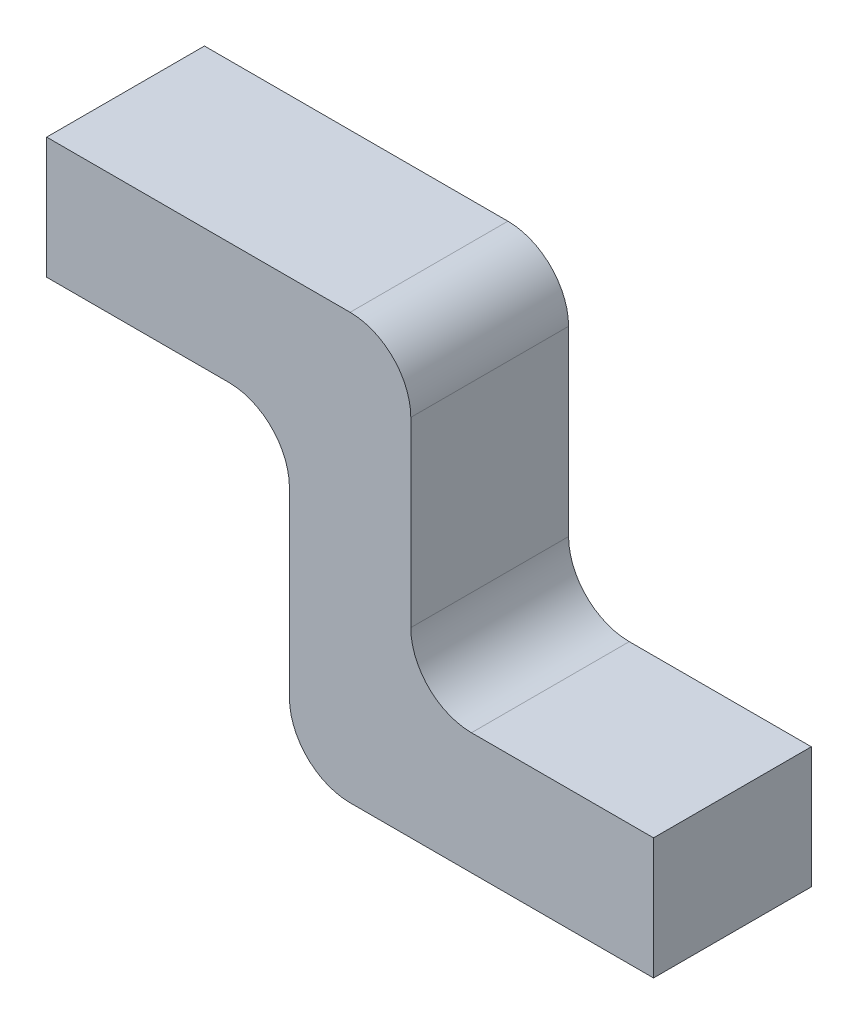
ISO-10303-21;
HEADER;
FILE_DESCRIPTION(('STEP AP214'),'2;1');
FILE_NAME('part.step','',(''),(''),'','','');
FILE_SCHEMA(('AUTOMOTIVE_DESIGN { 1 0 10303 214 1 1 1 1 }'));
ENDSEC;
DATA;
#1=APPLICATION_CONTEXT('core data for automotive mechanical design processes');
#2=APPLICATION_PROTOCOL_DEFINITION('international standard','automotive_design',2000,#1);
#3=PRODUCT_CONTEXT('',#1,'mechanical');
#4=PRODUCT('Part','Part','',(#3));
#5=PRODUCT_RELATED_PRODUCT_CATEGORY('part','',(#4));
#6=PRODUCT_DEFINITION_FORMATION('','',#4);
#7=PRODUCT_DEFINITION_CONTEXT('part definition',#1,'design');
#8=PRODUCT_DEFINITION('design','',#6,#7);
#9=PRODUCT_DEFINITION_SHAPE('','',#8);
#10=(LENGTH_UNIT() NAMED_UNIT(*) SI_UNIT(.MILLI.,.METRE.));
#11=(NAMED_UNIT(*) PLANE_ANGLE_UNIT() SI_UNIT($,.RADIAN.));
#12=(NAMED_UNIT(*) SI_UNIT($,.STERADIAN.) SOLID_ANGLE_UNIT());
#13=UNCERTAINTY_MEASURE_WITH_UNIT(LENGTH_MEASURE(1.E-05),#10,'distance_accuracy_value','');
#14=(GEOMETRIC_REPRESENTATION_CONTEXT(3) GLOBAL_UNCERTAINTY_ASSIGNED_CONTEXT((#13)) GLOBAL_UNIT_ASSIGNED_CONTEXT((#10,
#11,#12)) REPRESENTATION_CONTEXT('',''));
#15=CARTESIAN_POINT('',(0.,0.,0.));
#16=DIRECTION('',(0.,0.,1.));
#17=DIRECTION('',(1.,0.,0.));
#18=AXIS2_PLACEMENT_3D('',#15,#16,#17);
#19=CARTESIAN_POINT('',(0.3,0.4,0.13));
#20=DIRECTION('',(0.,0.,1.));
#21=DIRECTION('',(1.,0.,0.));
#22=AXIS2_PLACEMENT_3D('',#19,#20,#21);
#23=PLANE('',#22);
#24=DIRECTION('',(0.,1.,0.));
#25=VECTOR('',#24,1.);
#26=CARTESIAN_POINT('',(0.6,0.3,0.13));
#27=LINE('',#26,#25);
#28=CARTESIAN_POINT('',(0.6,0.6,0.13));
#29=VERTEX_POINT('',#28);
#30=CARTESIAN_POINT('',(0.6,0.3,0.13));
#31=VERTEX_POINT('',#30);
#32=EDGE_CURVE('E185',#29,#31,#27,.F.);
#33=ORIENTED_EDGE('',*,*,#32,.F.);
#34=CARTESIAN_POINT('',(0.5,0.6,0.13));
#35=DIRECTION('',(0.,0.,1.));
#36=DIRECTION('',(1.,0.,0.));
#37=AXIS2_PLACEMENT_3D('',#34,#35,#36);
#38=CIRCLE('',#37,0.1);
#39=CARTESIAN_POINT('',(0.5,0.7,0.13));
#40=VERTEX_POINT('',#39);
#41=EDGE_CURVE('E187',#40,#29,#38,.F.);
#42=ORIENTED_EDGE('',*,*,#41,.F.);
#43=DIRECTION('',(-1.,0.,0.));
#44=VECTOR('',#43,1.);
#45=CARTESIAN_POINT('',(0.5,0.7,0.13));
#46=LINE('',#45,#44);
#47=CARTESIAN_POINT('',(0.,0.7,0.13));
#48=VERTEX_POINT('',#47);
#49=EDGE_CURVE('E126',#48,#40,#46,.F.);
#50=ORIENTED_EDGE('',*,*,#49,.F.);
#51=DIRECTION('',(0.,-1.,0.));
#52=VECTOR('',#51,1.);
#53=CARTESIAN_POINT('',(0.,0.7,0.13));
#54=LINE('',#53,#52);
#55=CARTESIAN_POINT('',(0.,0.5,0.13));
#56=VERTEX_POINT('',#55);
#57=EDGE_CURVE('E124',#56,#48,#54,.F.);
#58=ORIENTED_EDGE('',*,*,#57,.F.);
#59=DIRECTION('',(1.,0.,0.));
#60=VECTOR('',#59,1.);
#61=CARTESIAN_POINT('',(0.,0.5,0.13));
#62=LINE('',#61,#60);
#63=CARTESIAN_POINT('',(0.3,0.5,0.13));
#64=VERTEX_POINT('',#63);
#65=EDGE_CURVE('E88',#64,#56,#62,.F.);
#66=ORIENTED_EDGE('',*,*,#65,.F.);
#67=CARTESIAN_POINT('',(0.3,0.4,0.13));
#68=DIRECTION('',(0.,0.,1.));
#69=DIRECTION('',(1.,0.,0.));
#70=AXIS2_PLACEMENT_3D('',#67,#68,#69);
#71=CIRCLE('',#70,0.1);
#72=CARTESIAN_POINT('',(0.4,0.4,0.13));
#73=VERTEX_POINT('',#72);
#74=EDGE_CURVE('E20',#64,#73,#71,.F.);
#75=ORIENTED_EDGE('',*,*,#74,.T.);
#76=DIRECTION('',(0.,1.,0.));
#77=VECTOR('',#76,1.);
#78=CARTESIAN_POINT('',(0.4,0.4,0.13));
#79=LINE('',#78,#77);
#80=CARTESIAN_POINT('',(0.4,0.1,0.13));
#81=VERTEX_POINT('',#80);
#82=EDGE_CURVE('E230',#81,#73,#79,.T.);
#83=ORIENTED_EDGE('',*,*,#82,.F.);
#84=CARTESIAN_POINT('',(0.5,0.1,0.13));
#85=DIRECTION('',(0.,0.,1.));
#86=DIRECTION('',(1.,0.,0.));
#87=AXIS2_PLACEMENT_3D('',#84,#85,#86);
#88=CIRCLE('',#87,0.1);
#89=CARTESIAN_POINT('',(0.5,0.,0.13));
#90=VERTEX_POINT('',#89);
#91=EDGE_CURVE('E227',#90,#81,#88,.F.);
#92=ORIENTED_EDGE('',*,*,#91,.F.);
#93=DIRECTION('',(1.,0.,0.));
#94=VECTOR('',#93,1.);
#95=CARTESIAN_POINT('',(0.5,0.,0.13));
#96=LINE('',#95,#94);
#97=CARTESIAN_POINT('',(1.,0.,0.13));
#98=VERTEX_POINT('',#97);
#99=EDGE_CURVE('E224',#98,#90,#96,.F.);
#100=ORIENTED_EDGE('',*,*,#99,.F.);
#101=DIRECTION('',(0.,1.,0.));
#102=VECTOR('',#101,1.);
#103=CARTESIAN_POINT('',(1.,0.,0.13));
#104=LINE('',#103,#102);
#105=CARTESIAN_POINT('',(1.,0.2,0.13));
#106=VERTEX_POINT('',#105);
#107=EDGE_CURVE('E219',#106,#98,#104,.F.);
#108=ORIENTED_EDGE('',*,*,#107,.F.);
#109=DIRECTION('',(-1.,0.,0.));
#110=VECTOR('',#109,1.);
#111=CARTESIAN_POINT('',(1.,0.2,0.13));
#112=LINE('',#111,#110);
#113=CARTESIAN_POINT('',(0.7,0.2,0.13));
#114=VERTEX_POINT('',#113);
#115=EDGE_CURVE('E207',#114,#106,#112,.F.);
#116=ORIENTED_EDGE('',*,*,#115,.F.);
#117=CARTESIAN_POINT('',(0.7,0.3,0.13));
#118=DIRECTION('',(0.,0.,1.));
#119=DIRECTION('',(1.,0.,0.));
#120=AXIS2_PLACEMENT_3D('',#117,#118,#119);
#121=CIRCLE('',#120,0.1);
#122=EDGE_CURVE('E189',#114,#31,#121,.F.);
#123=ORIENTED_EDGE('',*,*,#122,.T.);
#124=EDGE_LOOP('',(#33,#42,#50,#58,#66,#75,#83,#92,#100,#108,#116,#123));
#125=FACE_BOUND('',#124,.T.);
#126=ADVANCED_FACE('F17',(#125),#23,.T.);
#127=CARTESIAN_POINT('',(0.,0.7,-0.13));
#128=DIRECTION('',(-1.,0.,0.));
#129=DIRECTION('',(0.,-1.,0.));
#130=AXIS2_PLACEMENT_3D('',#127,#128,#129);
#131=PLANE('',#130);
#132=DIRECTION('',(0.,0.,1.));
#133=VECTOR('',#132,1.);
#134=CARTESIAN_POINT('',(0.,0.7,-0.13));
#135=LINE('',#134,#133);
#136=CARTESIAN_POINT('',(0.,0.7,-0.13));
#137=VERTEX_POINT('',#136);
#138=EDGE_CURVE('E122',#137,#48,#135,.T.);
#139=ORIENTED_EDGE('',*,*,#138,.F.);
#140=DIRECTION('',(0.,1.,0.));
#141=VECTOR('',#140,1.);
#142=CARTESIAN_POINT('',(0.,0.4,-0.13));
#143=LINE('',#142,#141);
#144=CARTESIAN_POINT('',(0.,0.5,-0.13));
#145=VERTEX_POINT('',#144);
#146=EDGE_CURVE('E110',#137,#145,#143,.F.);
#147=ORIENTED_EDGE('',*,*,#146,.T.);
#148=DIRECTION('',(0.,0.,1.));
#149=VECTOR('',#148,1.);
#150=CARTESIAN_POINT('',(0.,0.5,-0.13));
#151=LINE('',#150,#149);
#152=EDGE_CURVE('E233',#56,#145,#151,.F.);
#153=ORIENTED_EDGE('',*,*,#152,.F.);
#154=ORIENTED_EDGE('',*,*,#57,.T.);
#155=EDGE_LOOP('',(#139,#147,#153,#154));
#156=FACE_BOUND('',#155,.T.);
#157=ADVANCED_FACE('F123',(#156),#131,.T.);
#158=CARTESIAN_POINT('',(0.,0.5,-0.13));
#159=DIRECTION('',(0.,-1.,0.));
#160=DIRECTION('',(1.,0.,0.));
#161=AXIS2_PLACEMENT_3D('',#158,#159,#160);
#162=PLANE('',#161);
#163=ORIENTED_EDGE('',*,*,#152,.T.);
#164=DIRECTION('',(1.,0.,0.));
#165=VECTOR('',#164,1.);
#166=CARTESIAN_POINT('',(0.3,0.5,-0.13));
#167=LINE('',#166,#165);
#168=CARTESIAN_POINT('',(0.3,0.5,-0.13));
#169=VERTEX_POINT('',#168);
#170=EDGE_CURVE('E117',#145,#169,#167,.T.);
#171=ORIENTED_EDGE('',*,*,#170,.T.);
#172=DIRECTION('',(0.,0.,1.));
#173=VECTOR('',#172,1.);
#174=CARTESIAN_POINT('',(0.3,0.5,-0.13));
#175=LINE('',#174,#173);
#176=EDGE_CURVE('E231',#169,#64,#175,.T.);
#177=ORIENTED_EDGE('',*,*,#176,.T.);
#178=ORIENTED_EDGE('',*,*,#65,.T.);
#179=EDGE_LOOP('',(#163,#171,#177,#178));
#180=FACE_BOUND('',#179,.T.);
#181=ADVANCED_FACE('F173',(#180),#162,.T.);
#182=CARTESIAN_POINT('',(0.3,0.4,-0.13));
#183=DIRECTION('',(0.,0.,1.));
#184=DIRECTION('',(1.,0.,0.));
#185=AXIS2_PLACEMENT_3D('',#182,#183,#184);
#186=CYLINDRICAL_SURFACE('',#185,0.1);
#187=ORIENTED_EDGE('',*,*,#74,.F.);
#188=ORIENTED_EDGE('',*,*,#176,.F.);
#189=CARTESIAN_POINT('',(0.3,0.4,-0.13));
#190=DIRECTION('',(0.,0.,1.));
#191=DIRECTION('',(1.,0.,0.));
#192=AXIS2_PLACEMENT_3D('',#189,#190,#191);
#193=CIRCLE('',#192,0.1);
#194=CARTESIAN_POINT('',(0.4,0.4,-0.13));
#195=VERTEX_POINT('',#194);
#196=EDGE_CURVE('E264',#169,#195,#193,.F.);
#197=ORIENTED_EDGE('',*,*,#196,.T.);
#198=DIRECTION('',(0.,0.,1.));
#199=VECTOR('',#198,1.);
#200=CARTESIAN_POINT('',(0.4,0.4,-0.13));
#201=LINE('',#200,#199);
#202=EDGE_CURVE('E228',#73,#195,#201,.F.);
#203=ORIENTED_EDGE('',*,*,#202,.F.);
#204=EDGE_LOOP('',(#187,#188,#197,#203));
#205=FACE_BOUND('',#204,.T.);
#206=ADVANCED_FACE('F169',(#205),#186,.F.);
#207=CARTESIAN_POINT('',(0.4,0.4,-0.13));
#208=DIRECTION('',(-1.,0.,0.));
#209=DIRECTION('',(0.,0.,1.));
#210=AXIS2_PLACEMENT_3D('',#207,#208,#209);
#211=PLANE('',#210);
#212=ORIENTED_EDGE('',*,*,#202,.T.);
#213=DIRECTION('',(0.,1.,0.));
#214=VECTOR('',#213,1.);
#215=CARTESIAN_POINT('',(0.4,0.4,-0.13));
#216=LINE('',#215,#214);
#217=CARTESIAN_POINT('',(0.4,0.1,-0.13));
#218=VERTEX_POINT('',#217);
#219=EDGE_CURVE('E263',#195,#218,#216,.F.);
#220=ORIENTED_EDGE('',*,*,#219,.T.);
#221=DIRECTION('',(0.,0.,1.));
#222=VECTOR('',#221,1.);
#223=CARTESIAN_POINT('',(0.4,0.1,-0.13));
#224=LINE('',#223,#222);
#225=EDGE_CURVE('E225',#81,#218,#224,.F.);
#226=ORIENTED_EDGE('',*,*,#225,.F.);
#227=ORIENTED_EDGE('',*,*,#82,.T.);
#228=EDGE_LOOP('',(#212,#220,#226,#227));
#229=FACE_BOUND('',#228,.T.);
#230=ADVANCED_FACE('F165',(#229),#211,.T.);
#231=CARTESIAN_POINT('',(0.5,0.1,-0.13));
#232=DIRECTION('',(0.,0.,1.));
#233=DIRECTION('',(1.,0.,0.));
#234=AXIS2_PLACEMENT_3D('',#231,#232,#233);
#235=CYLINDRICAL_SURFACE('',#234,0.1);
#236=ORIENTED_EDGE('',*,*,#225,.T.);
#237=CARTESIAN_POINT('',(0.5,0.1,-0.13));
#238=DIRECTION('',(0.,0.,1.));
#239=DIRECTION('',(1.,0.,0.));
#240=AXIS2_PLACEMENT_3D('',#237,#238,#239);
#241=CIRCLE('',#240,0.1);
#242=CARTESIAN_POINT('',(0.5,0.,-0.13));
#243=VERTEX_POINT('',#242);
#244=EDGE_CURVE('E260',#218,#243,#241,.T.);
#245=ORIENTED_EDGE('',*,*,#244,.T.);
#246=DIRECTION('',(0.,0.,-1.));
#247=VECTOR('',#246,1.);
#248=CARTESIAN_POINT('',(0.5,0.,-0.13));
#249=LINE('',#248,#247);
#250=EDGE_CURVE('E222',#90,#243,#249,.T.);
#251=ORIENTED_EDGE('',*,*,#250,.F.);
#252=ORIENTED_EDGE('',*,*,#91,.T.);
#253=EDGE_LOOP('',(#236,#245,#251,#252));
#254=FACE_BOUND('',#253,.T.);
#255=ADVANCED_FACE('F161',(#254),#235,.T.);
#256=CARTESIAN_POINT('',(0.5,0.,-0.13));
#257=DIRECTION('',(0.,-1.,0.));
#258=DIRECTION('',(0.,0.,-1.));
#259=AXIS2_PLACEMENT_3D('',#256,#257,#258);
#260=PLANE('',#259);
#261=ORIENTED_EDGE('',*,*,#250,.T.);
#262=DIRECTION('',(1.,0.,0.));
#263=VECTOR('',#262,1.);
#264=CARTESIAN_POINT('',(0.3,0.,-0.13));
#265=LINE('',#264,#263);
#266=CARTESIAN_POINT('',(1.,0.,-0.13));
#267=VERTEX_POINT('',#266);
#268=EDGE_CURVE('E214',#243,#267,#265,.T.);
#269=ORIENTED_EDGE('',*,*,#268,.T.);
#270=DIRECTION('',(0.,0.,-1.));
#271=VECTOR('',#270,1.);
#272=CARTESIAN_POINT('',(1.,0.,-0.13));
#273=LINE('',#272,#271);
#274=EDGE_CURVE('E217',#98,#267,#273,.T.);
#275=ORIENTED_EDGE('',*,*,#274,.F.);
#276=ORIENTED_EDGE('',*,*,#99,.T.);
#277=EDGE_LOOP('',(#261,#269,#275,#276));
#278=FACE_BOUND('',#277,.T.);
#279=ADVANCED_FACE('F157',(#278),#260,.T.);
#280=CARTESIAN_POINT('',(1.,0.,-0.13));
#281=DIRECTION('',(1.,0.,0.));
#282=DIRECTION('',(0.,0.,-1.));
#283=AXIS2_PLACEMENT_3D('',#280,#281,#282);
#284=PLANE('',#283);
#285=ORIENTED_EDGE('',*,*,#274,.T.);
#286=DIRECTION('',(0.,1.,0.));
#287=VECTOR('',#286,1.);
#288=CARTESIAN_POINT('',(1.,0.4,-0.13));
#289=LINE('',#288,#287);
#290=CARTESIAN_POINT('',(1.,0.2,-0.13));
#291=VERTEX_POINT('',#290);
#292=EDGE_CURVE('E210',#267,#291,#289,.T.);
#293=ORIENTED_EDGE('',*,*,#292,.T.);
#294=DIRECTION('',(0.,0.,1.));
#295=VECTOR('',#294,1.);
#296=CARTESIAN_POINT('',(1.,0.2,-0.13));
#297=LINE('',#296,#295);
#298=EDGE_CURVE('E205',#106,#291,#297,.F.);
#299=ORIENTED_EDGE('',*,*,#298,.F.);
#300=ORIENTED_EDGE('',*,*,#107,.T.);
#301=EDGE_LOOP('',(#285,#293,#299,#300));
#302=FACE_BOUND('',#301,.T.);
#303=ADVANCED_FACE('F153',(#302),#284,.T.);
#304=CARTESIAN_POINT('',(1.,0.2,-0.13));
#305=DIRECTION('',(0.,1.,0.));
#306=DIRECTION('',(-1.,0.,0.));
#307=AXIS2_PLACEMENT_3D('',#304,#305,#306);
#308=PLANE('',#307);
#309=ORIENTED_EDGE('',*,*,#298,.T.);
#310=DIRECTION('',(1.,0.,0.));
#311=VECTOR('',#310,1.);
#312=CARTESIAN_POINT('',(0.3,0.2,-0.13));
#313=LINE('',#312,#311);
#314=CARTESIAN_POINT('',(0.7,0.2,-0.13));
#315=VERTEX_POINT('',#314);
#316=EDGE_CURVE('E213',#291,#315,#313,.F.);
#317=ORIENTED_EDGE('',*,*,#316,.T.);
#318=DIRECTION('',(0.,0.,1.));
#319=VECTOR('',#318,1.);
#320=CARTESIAN_POINT('',(0.7,0.2,-0.13));
#321=LINE('',#320,#319);
#322=EDGE_CURVE('E202',#315,#114,#321,.T.);
#323=ORIENTED_EDGE('',*,*,#322,.T.);
#324=ORIENTED_EDGE('',*,*,#115,.T.);
#325=EDGE_LOOP('',(#309,#317,#323,#324));
#326=FACE_BOUND('',#325,.T.);
#327=ADVANCED_FACE('F149',(#326),#308,.T.);
#328=CARTESIAN_POINT('',(0.7,0.3,-0.13));
#329=DIRECTION('',(0.,0.,1.));
#330=DIRECTION('',(1.,0.,0.));
#331=AXIS2_PLACEMENT_3D('',#328,#329,#330);
#332=CYLINDRICAL_SURFACE('',#331,0.1);
#333=ORIENTED_EDGE('',*,*,#122,.F.);
#334=ORIENTED_EDGE('',*,*,#322,.F.);
#335=CARTESIAN_POINT('',(0.7,0.3,-0.13));
#336=DIRECTION('',(0.,0.,1.));
#337=DIRECTION('',(1.,0.,0.));
#338=AXIS2_PLACEMENT_3D('',#335,#336,#337);
#339=CIRCLE('',#338,0.1);
#340=CARTESIAN_POINT('',(0.6,0.3,-0.13));
#341=VERTEX_POINT('',#340);
#342=EDGE_CURVE('E257',#315,#341,#339,.F.);
#343=ORIENTED_EDGE('',*,*,#342,.T.);
#344=DIRECTION('',(0.,0.,-1.));
#345=VECTOR('',#344,1.);
#346=CARTESIAN_POINT('',(0.6,0.3,-0.13));
#347=LINE('',#346,#345);
#348=EDGE_CURVE('E191',#31,#341,#347,.T.);
#349=ORIENTED_EDGE('',*,*,#348,.F.);
#350=EDGE_LOOP('',(#333,#334,#343,#349));
#351=FACE_BOUND('',#350,.T.);
#352=ADVANCED_FACE('F145',(#351),#332,.F.);
#353=CARTESIAN_POINT('',(0.6,0.3,-0.13));
#354=DIRECTION('',(1.,0.,0.));
#355=DIRECTION('',(0.,0.,-1.));
#356=AXIS2_PLACEMENT_3D('',#353,#354,#355);
#357=PLANE('',#356);
#358=ORIENTED_EDGE('',*,*,#348,.T.);
#359=DIRECTION('',(0.,1.,0.));
#360=VECTOR('',#359,1.);
#361=CARTESIAN_POINT('',(0.6,0.4,-0.13));
#362=LINE('',#361,#360);
#363=CARTESIAN_POINT('',(0.6,0.6,-0.13));
#364=VERTEX_POINT('',#363);
#365=EDGE_CURVE('E195',#341,#364,#362,.T.);
#366=ORIENTED_EDGE('',*,*,#365,.T.);
#367=DIRECTION('',(0.,0.,1.));
#368=VECTOR('',#367,1.);
#369=CARTESIAN_POINT('',(0.6,0.6,-0.13));
#370=LINE('',#369,#368);
#371=EDGE_CURVE('E127',#29,#364,#370,.F.);
#372=ORIENTED_EDGE('',*,*,#371,.F.);
#373=ORIENTED_EDGE('',*,*,#32,.T.);
#374=EDGE_LOOP('',(#358,#366,#372,#373));
#375=FACE_BOUND('',#374,.T.);
#376=ADVANCED_FACE('F139',(#375),#357,.T.);
#377=CARTESIAN_POINT('',(0.5,0.6,-0.13));
#378=DIRECTION('',(0.,0.,1.));
#379=DIRECTION('',(1.,0.,0.));
#380=AXIS2_PLACEMENT_3D('',#377,#378,#379);
#381=CYLINDRICAL_SURFACE('',#380,0.1);
#382=ORIENTED_EDGE('',*,*,#371,.T.);
#383=CARTESIAN_POINT('',(0.5,0.6,-0.13));
#384=DIRECTION('',(0.,0.,1.));
#385=DIRECTION('',(1.,0.,0.));
#386=AXIS2_PLACEMENT_3D('',#383,#384,#385);
#387=CIRCLE('',#386,0.1);
#388=CARTESIAN_POINT('',(0.5,0.7,-0.13));
#389=VERTEX_POINT('',#388);
#390=EDGE_CURVE('E26',#364,#389,#387,.T.);
#391=ORIENTED_EDGE('',*,*,#390,.T.);
#392=DIRECTION('',(0.,0.,1.));
#393=VECTOR('',#392,1.);
#394=CARTESIAN_POINT('',(0.5,0.7,-0.13));
#395=LINE('',#394,#393);
#396=EDGE_CURVE('E34',#40,#389,#395,.F.);
#397=ORIENTED_EDGE('',*,*,#396,.F.);
#398=ORIENTED_EDGE('',*,*,#41,.T.);
#399=EDGE_LOOP('',(#382,#391,#397,#398));
#400=FACE_BOUND('',#399,.T.);
#401=ADVANCED_FACE('F131',(#400),#381,.T.);
#402=CARTESIAN_POINT('',(0.5,0.7,-0.13));
#403=DIRECTION('',(0.,1.,0.));
#404=DIRECTION('',(-1.,0.,0.));
#405=AXIS2_PLACEMENT_3D('',#402,#403,#404);
#406=PLANE('',#405);
#407=ORIENTED_EDGE('',*,*,#396,.T.);
#408=DIRECTION('',(1.,0.,0.));
#409=VECTOR('',#408,1.);
#410=CARTESIAN_POINT('',(0.3,0.7,-0.13));
#411=LINE('',#410,#409);
#412=EDGE_CURVE('E11',#389,#137,#411,.F.);
#413=ORIENTED_EDGE('',*,*,#412,.T.);
#414=ORIENTED_EDGE('',*,*,#138,.T.);
#415=ORIENTED_EDGE('',*,*,#49,.T.);
#416=EDGE_LOOP('',(#407,#413,#414,#415));
#417=FACE_BOUND('',#416,.T.);
#418=ADVANCED_FACE('F129',(#417),#406,.T.);
#419=CARTESIAN_POINT('',(0.3,0.4,-0.13));
#420=DIRECTION('',(0.,0.,1.));
#421=DIRECTION('',(1.,0.,0.));
#422=AXIS2_PLACEMENT_3D('',#419,#420,#421);
#423=PLANE('',#422);
#424=ORIENTED_EDGE('',*,*,#390,.F.);
#425=ORIENTED_EDGE('',*,*,#365,.F.);
#426=ORIENTED_EDGE('',*,*,#342,.F.);
#427=ORIENTED_EDGE('',*,*,#316,.F.);
#428=ORIENTED_EDGE('',*,*,#292,.F.);
#429=ORIENTED_EDGE('',*,*,#268,.F.);
#430=ORIENTED_EDGE('',*,*,#244,.F.);
#431=ORIENTED_EDGE('',*,*,#219,.F.);
#432=ORIENTED_EDGE('',*,*,#196,.F.);
#433=ORIENTED_EDGE('',*,*,#170,.F.);
#434=ORIENTED_EDGE('',*,*,#146,.F.);
#435=ORIENTED_EDGE('',*,*,#412,.F.);
#436=EDGE_LOOP('',(#424,#425,#426,#427,#428,#429,#430,#431,#432,#433,#434,#435));
#437=FACE_BOUND('',#436,.T.);
#438=ADVANCED_FACE('F113',(#437),#423,.F.);
#439=CLOSED_SHELL('',(#126,#157,#181,#206,#230,#255,#279,#303,#327,#352,#376,#401,#418,#438));
#440=MANIFOLD_SOLID_BREP('B1',#439);
#441=ADVANCED_BREP_SHAPE_REPRESENTATION('',(#18,#440),#14);
#442=SHAPE_DEFINITION_REPRESENTATION(#9,#441);
ENDSEC;
END-ISO-10303-21;
